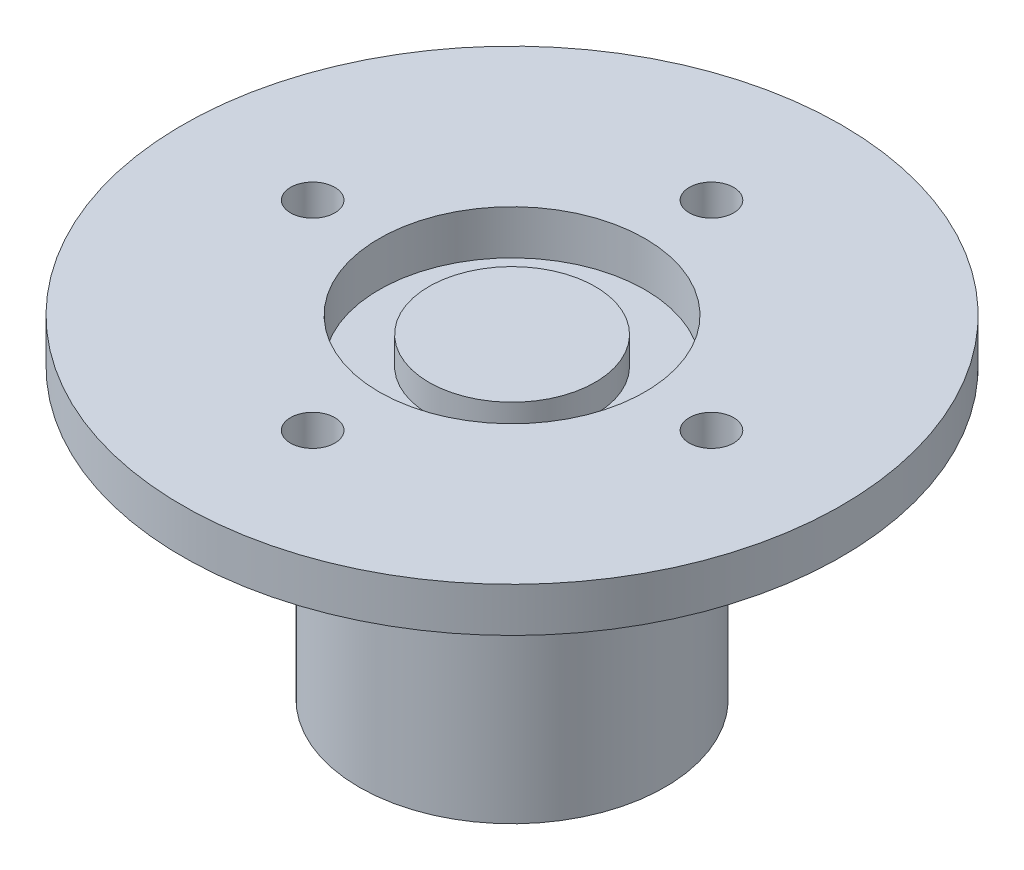
ISO-10303-21;
HEADER;
FILE_DESCRIPTION(('STEP AP214'),'2;1');
FILE_NAME('part.step','',(''),(''),'','','');
FILE_SCHEMA(('AUTOMOTIVE_DESIGN { 1 0 10303 214 1 1 1 1 }'));
ENDSEC;
DATA;
#1=APPLICATION_CONTEXT('core data for automotive mechanical design processes');
#2=APPLICATION_PROTOCOL_DEFINITION('international standard','automotive_design',2000,#1);
#3=PRODUCT_CONTEXT('',#1,'mechanical');
#4=PRODUCT('Part','Part','',(#3));
#5=PRODUCT_RELATED_PRODUCT_CATEGORY('part','',(#4));
#6=PRODUCT_DEFINITION_FORMATION('','',#4);
#7=PRODUCT_DEFINITION_CONTEXT('part definition',#1,'design');
#8=PRODUCT_DEFINITION('design','',#6,#7);
#9=PRODUCT_DEFINITION_SHAPE('','',#8);
#10=(LENGTH_UNIT() NAMED_UNIT(*) SI_UNIT(.MILLI.,.METRE.));
#11=(NAMED_UNIT(*) PLANE_ANGLE_UNIT() SI_UNIT($,.RADIAN.));
#12=(NAMED_UNIT(*) SI_UNIT($,.STERADIAN.) SOLID_ANGLE_UNIT());
#13=UNCERTAINTY_MEASURE_WITH_UNIT(LENGTH_MEASURE(1.E-05),#10,'distance_accuracy_value','');
#14=(GEOMETRIC_REPRESENTATION_CONTEXT(3) GLOBAL_UNCERTAINTY_ASSIGNED_CONTEXT((#13)) GLOBAL_UNIT_ASSIGNED_CONTEXT((#10,
#11,#12)) REPRESENTATION_CONTEXT('',''));
#15=CARTESIAN_POINT('',(0.,0.,0.));
#16=DIRECTION('',(0.,0.,1.));
#17=DIRECTION('',(1.,0.,0.));
#18=AXIS2_PLACEMENT_3D('',#15,#16,#17);
#19=CARTESIAN_POINT('',(0.,0.,0.));
#20=DIRECTION('',(0.,-1.,0.));
#21=DIRECTION('',(0.,0.,-1.));
#22=AXIS2_PLACEMENT_3D('',#19,#20,#21);
#23=PLANE('',#22);
#24=CARTESIAN_POINT('',(0.,0.,0.));
#25=DIRECTION('',(0.,1.,0.));
#26=DIRECTION('',(0.,0.,1.));
#27=AXIS2_PLACEMENT_3D('',#24,#25,#26);
#28=CIRCLE('',#27,7.5);
#29=CARTESIAN_POINT('',(0.,0.,7.5));
#30=VERTEX_POINT('',#29);
#31=EDGE_CURVE('E52',#30,#30,#28,.T.);
#32=ORIENTED_EDGE('',*,*,#31,.F.);
#33=EDGE_LOOP('',(#32));
#34=FACE_BOUND('',#33,.T.);
#35=CARTESIAN_POINT('',(0.,0.,0.));
#36=DIRECTION('',(0.,-1.,0.));
#37=DIRECTION('',(0.,0.,-1.));
#38=AXIS2_PLACEMENT_3D('',#35,#36,#37);
#39=CIRCLE('',#38,12.);
#40=CARTESIAN_POINT('',(0.,0.,-12.));
#41=VERTEX_POINT('',#40);
#42=EDGE_CURVE('E11',#41,#41,#39,.T.);
#43=ORIENTED_EDGE('',*,*,#42,.F.);
#44=EDGE_LOOP('',(#43));
#45=FACE_BOUND('',#44,.T.);
#46=ADVANCED_FACE('F39',(#34,#45),#23,.F.);
#47=CARTESIAN_POINT('',(0.,2.5,0.));
#48=DIRECTION('',(0.,-1.,0.));
#49=DIRECTION('',(0.,0.,-1.));
#50=AXIS2_PLACEMENT_3D('',#47,#48,#49);
#51=CYLINDRICAL_SURFACE('',#50,7.5);
#52=CARTESIAN_POINT('',(0.,2.5,0.));
#53=DIRECTION('',(0.,1.,0.));
#54=DIRECTION('',(0.,0.,1.));
#55=AXIS2_PLACEMENT_3D('',#52,#53,#54);
#56=CIRCLE('',#55,7.5);
#57=CARTESIAN_POINT('',(0.,2.5,7.5));
#58=VERTEX_POINT('',#57);
#59=EDGE_CURVE('E47',#58,#58,#56,.T.);
#60=ORIENTED_EDGE('',*,*,#59,.F.);
#61=EDGE_LOOP('',(#60));
#62=FACE_BOUND('',#61,.T.);
#63=ORIENTED_EDGE('',*,*,#31,.T.);
#64=EDGE_LOOP('',(#63));
#65=FACE_BOUND('',#64,.T.);
#66=ADVANCED_FACE('F41',(#62,#65),#51,.T.);
#67=CARTESIAN_POINT('',(0.,2.5,0.));
#68=DIRECTION('',(0.,1.,0.));
#69=DIRECTION('',(0.,0.,1.));
#70=AXIS2_PLACEMENT_3D('',#67,#68,#69);
#71=PLANE('',#70);
#72=ORIENTED_EDGE('',*,*,#59,.T.);
#73=EDGE_LOOP('',(#72));
#74=FACE_BOUND('',#73,.T.);
#75=ADVANCED_FACE('F107',(#74),#71,.T.);
#76=CARTESIAN_POINT('',(0.,4.,0.));
#77=DIRECTION('',(0.,-1.,0.));
#78=DIRECTION('',(0.,0.,-1.));
#79=AXIS2_PLACEMENT_3D('',#76,#77,#78);
#80=CYLINDRICAL_SURFACE('',#79,29.75);
#81=CARTESIAN_POINT('',(0.,4.,0.));
#82=DIRECTION('',(0.,-1.,0.));
#83=DIRECTION('',(0.,0.,-1.));
#84=AXIS2_PLACEMENT_3D('',#81,#82,#83);
#85=CIRCLE('',#84,29.75);
#86=CARTESIAN_POINT('',(0.,4.,-29.75));
#87=VERTEX_POINT('',#86);
#88=EDGE_CURVE('E85',#87,#87,#85,.T.);
#89=ORIENTED_EDGE('',*,*,#88,.T.);
#90=EDGE_LOOP('',(#89));
#91=FACE_BOUND('',#90,.T.);
#92=CARTESIAN_POINT('',(0.,0.,0.));
#93=DIRECTION('',(0.,-1.,0.));
#94=DIRECTION('',(0.,0.,-1.));
#95=AXIS2_PLACEMENT_3D('',#92,#93,#94);
#96=CIRCLE('',#95,29.75);
#97=CARTESIAN_POINT('',(0.,0.,-29.75));
#98=VERTEX_POINT('',#97);
#99=EDGE_CURVE('E84',#98,#98,#96,.T.);
#100=ORIENTED_EDGE('',*,*,#99,.F.);
#101=EDGE_LOOP('',(#100));
#102=FACE_BOUND('',#101,.T.);
#103=ADVANCED_FACE('F118',(#91,#102),#80,.T.);
#104=CARTESIAN_POINT('',(0.,4.,0.));
#105=DIRECTION('',(0.,-1.,0.));
#106=DIRECTION('',(0.,0.,-1.));
#107=AXIS2_PLACEMENT_3D('',#104,#105,#106);
#108=PLANE('',#107);
#109=CARTESIAN_POINT('',(0.,4.,-18.));
#110=DIRECTION('',(0.,1.,0.));
#111=DIRECTION('',(0.,0.,1.));
#112=AXIS2_PLACEMENT_3D('',#109,#110,#111);
#113=CIRCLE('',#112,2.);
#114=CARTESIAN_POINT('',(0.,4.,-16.));
#115=VERTEX_POINT('',#114);
#116=EDGE_CURVE('E60',#115,#115,#113,.T.);
#117=ORIENTED_EDGE('',*,*,#116,.F.);
#118=EDGE_LOOP('',(#117));
#119=FACE_BOUND('',#118,.T.);
#120=CARTESIAN_POINT('',(18.,4.,0.));
#121=DIRECTION('',(0.,1.,0.));
#122=DIRECTION('',(0.,0.,1.));
#123=AXIS2_PLACEMENT_3D('',#120,#121,#122);
#124=CIRCLE('',#123,2.);
#125=CARTESIAN_POINT('',(18.,4.,2.));
#126=VERTEX_POINT('',#125);
#127=EDGE_CURVE('E165',#126,#126,#124,.T.);
#128=ORIENTED_EDGE('',*,*,#127,.F.);
#129=EDGE_LOOP('',(#128));
#130=FACE_BOUND('',#129,.T.);
#131=CARTESIAN_POINT('',(0.,4.,18.));
#132=DIRECTION('',(0.,1.,0.));
#133=DIRECTION('',(0.,0.,1.));
#134=AXIS2_PLACEMENT_3D('',#131,#132,#133);
#135=CIRCLE('',#134,2.);
#136=CARTESIAN_POINT('',(0.,4.,20.));
#137=VERTEX_POINT('',#136);
#138=EDGE_CURVE('E168',#137,#137,#135,.T.);
#139=ORIENTED_EDGE('',*,*,#138,.F.);
#140=EDGE_LOOP('',(#139));
#141=FACE_BOUND('',#140,.T.);
#142=CARTESIAN_POINT('',(-18.,4.,0.));
#143=DIRECTION('',(0.,1.,0.));
#144=DIRECTION('',(0.,0.,1.));
#145=AXIS2_PLACEMENT_3D('',#142,#143,#144);
#146=CIRCLE('',#145,2.);
#147=CARTESIAN_POINT('',(-18.,4.,2.00000000000001));
#148=VERTEX_POINT('',#147);
#149=EDGE_CURVE('E79',#148,#148,#146,.T.);
#150=ORIENTED_EDGE('',*,*,#149,.F.);
#151=EDGE_LOOP('',(#150));
#152=FACE_BOUND('',#151,.T.);
#153=CARTESIAN_POINT('',(0.,4.,0.));
#154=DIRECTION('',(0.,-1.,0.));
#155=DIRECTION('',(0.,0.,-1.));
#156=AXIS2_PLACEMENT_3D('',#153,#154,#155);
#157=CIRCLE('',#156,12.);
#158=CARTESIAN_POINT('',(0.,4.,-12.));
#159=VERTEX_POINT('',#158);
#160=EDGE_CURVE('E76',#159,#159,#157,.T.);
#161=ORIENTED_EDGE('',*,*,#160,.T.);
#162=EDGE_LOOP('',(#161));
#163=FACE_BOUND('',#162,.T.);
#164=ORIENTED_EDGE('',*,*,#88,.F.);
#165=EDGE_LOOP('',(#164));
#166=FACE_BOUND('',#165,.T.);
#167=ADVANCED_FACE('F123',(#119,#130,#141,#152,#163,#166),#108,.F.);
#168=CARTESIAN_POINT('',(0.,0.,0.));
#169=DIRECTION('',(0.,-1.,0.));
#170=DIRECTION('',(0.,0.,-1.));
#171=AXIS2_PLACEMENT_3D('',#168,#169,#170);
#172=PLANE('',#171);
#173=CARTESIAN_POINT('',(0.,0.,-18.));
#174=DIRECTION('',(0.,-1.,0.));
#175=DIRECTION('',(0.,0.,-1.));
#176=AXIS2_PLACEMENT_3D('',#173,#174,#175);
#177=CIRCLE('',#176,2.);
#178=CARTESIAN_POINT('',(0.,0.,-20.));
#179=VERTEX_POINT('',#178);
#180=EDGE_CURVE('E43',#179,#179,#177,.T.);
#181=ORIENTED_EDGE('',*,*,#180,.F.);
#182=EDGE_LOOP('',(#181));
#183=FACE_BOUND('',#182,.T.);
#184=CARTESIAN_POINT('',(18.,0.,0.));
#185=DIRECTION('',(0.,-1.,0.));
#186=DIRECTION('',(0.,0.,-1.));
#187=AXIS2_PLACEMENT_3D('',#184,#185,#186);
#188=CIRCLE('',#187,2.);
#189=CARTESIAN_POINT('',(18.,0.,-2.));
#190=VERTEX_POINT('',#189);
#191=EDGE_CURVE('E62',#190,#190,#188,.T.);
#192=ORIENTED_EDGE('',*,*,#191,.F.);
#193=EDGE_LOOP('',(#192));
#194=FACE_BOUND('',#193,.T.);
#195=CARTESIAN_POINT('',(0.,0.,18.));
#196=DIRECTION('',(0.,-1.,0.));
#197=DIRECTION('',(0.,0.,-1.));
#198=AXIS2_PLACEMENT_3D('',#195,#196,#197);
#199=CIRCLE('',#198,2.);
#200=CARTESIAN_POINT('',(0.,0.,16.));
#201=VERTEX_POINT('',#200);
#202=EDGE_CURVE('E59',#201,#201,#199,.T.);
#203=ORIENTED_EDGE('',*,*,#202,.F.);
#204=EDGE_LOOP('',(#203));
#205=FACE_BOUND('',#204,.T.);
#206=CARTESIAN_POINT('',(-18.,0.,0.));
#207=DIRECTION('',(0.,-1.,0.));
#208=DIRECTION('',(0.,0.,-1.));
#209=AXIS2_PLACEMENT_3D('',#206,#207,#208);
#210=CIRCLE('',#209,2.);
#211=CARTESIAN_POINT('',(-18.,0.,-2.));
#212=VERTEX_POINT('',#211);
#213=EDGE_CURVE('E56',#212,#212,#210,.T.);
#214=ORIENTED_EDGE('',*,*,#213,.F.);
#215=EDGE_LOOP('',(#214));
#216=FACE_BOUND('',#215,.T.);
#217=CARTESIAN_POINT('',(0.,0.,0.));
#218=DIRECTION('',(0.,-1.,0.));
#219=DIRECTION('',(0.,0.,-1.));
#220=AXIS2_PLACEMENT_3D('',#217,#218,#219);
#221=CIRCLE('',#220,13.8);
#222=CARTESIAN_POINT('',(0.,0.,13.8));
#223=VERTEX_POINT('',#222);
#224=EDGE_CURVE('E88',#223,#223,#221,.T.);
#225=ORIENTED_EDGE('',*,*,#224,.F.);
#226=EDGE_LOOP('',(#225));
#227=FACE_BOUND('',#226,.T.);
#228=ORIENTED_EDGE('',*,*,#99,.T.);
#229=EDGE_LOOP('',(#228));
#230=FACE_BOUND('',#229,.T.);
#231=ADVANCED_FACE('F129',(#183,#194,#205,#216,#227,#230),#172,.T.);
#232=CARTESIAN_POINT('',(0.,4.,0.));
#233=DIRECTION('',(0.,-1.,0.));
#234=DIRECTION('',(0.,0.,-1.));
#235=AXIS2_PLACEMENT_3D('',#232,#233,#234);
#236=CYLINDRICAL_SURFACE('',#235,12.);
#237=ORIENTED_EDGE('',*,*,#160,.F.);
#238=EDGE_LOOP('',(#237));
#239=FACE_BOUND('',#238,.T.);
#240=ORIENTED_EDGE('',*,*,#42,.T.);
#241=EDGE_LOOP('',(#240));
#242=FACE_BOUND('',#241,.T.);
#243=ADVANCED_FACE('F135',(#239,#242),#236,.F.);
#244=CARTESIAN_POINT('',(0.,-26.,0.));
#245=DIRECTION('',(0.,-1.,0.));
#246=DIRECTION('',(0.,0.,-1.));
#247=AXIS2_PLACEMENT_3D('',#244,#245,#246);
#248=PLANE('',#247);
#249=CARTESIAN_POINT('',(0.,-26.,0.));
#250=DIRECTION('',(0.,-1.,0.));
#251=DIRECTION('',(0.,0.,-1.));
#252=AXIS2_PLACEMENT_3D('',#249,#250,#251);
#253=CIRCLE('',#252,5.);
#254=CARTESIAN_POINT('',(0.,-26.,-5.));
#255=VERTEX_POINT('',#254);
#256=EDGE_CURVE('E67',#255,#255,#253,.T.);
#257=ORIENTED_EDGE('',*,*,#256,.F.);
#258=EDGE_LOOP('',(#257));
#259=FACE_BOUND('',#258,.T.);
#260=CARTESIAN_POINT('',(0.,-26.,0.));
#261=DIRECTION('',(0.,-1.,0.));
#262=DIRECTION('',(0.,0.,-1.));
#263=AXIS2_PLACEMENT_3D('',#260,#261,#262);
#264=CIRCLE('',#263,13.8);
#265=CARTESIAN_POINT('',(0.,-26.,13.8));
#266=VERTEX_POINT('',#265);
#267=EDGE_CURVE('E93',#266,#266,#264,.T.);
#268=ORIENTED_EDGE('',*,*,#267,.T.);
#269=EDGE_LOOP('',(#268));
#270=FACE_BOUND('',#269,.T.);
#271=ADVANCED_FACE('F111',(#259,#270),#248,.T.);
#272=CARTESIAN_POINT('',(0.,-26.,0.));
#273=DIRECTION('',(0.,1.,0.));
#274=DIRECTION('',(0.,0.,1.));
#275=AXIS2_PLACEMENT_3D('',#272,#273,#274);
#276=CYLINDRICAL_SURFACE('',#275,13.8);
#277=CARTESIAN_POINT('',(0.,-26.,13.8));
#278=CARTESIAN_POINT('',(0.,-25.7291666666667,13.8));
#279=CARTESIAN_POINT('',(0.,-25.4583333333333,13.8));
#280=CARTESIAN_POINT('',(0.,-24.9166666666667,13.8));
#281=CARTESIAN_POINT('',(0.,-24.6458333333333,13.8));
#282=CARTESIAN_POINT('',(0.,-24.1041666666667,13.8));
#283=CARTESIAN_POINT('',(0.,-23.8333333333333,13.8));
#284=CARTESIAN_POINT('',(0.,-23.2916666666667,13.8));
#285=CARTESIAN_POINT('',(0.,-23.0208333333333,13.8));
#286=CARTESIAN_POINT('',(0.,-22.4791666666667,13.8));
#287=CARTESIAN_POINT('',(0.,-22.2083333333333,13.8));
#288=CARTESIAN_POINT('',(0.,-21.6666666666667,13.8));
#289=CARTESIAN_POINT('',(0.,-21.3958333333333,13.8));
#290=CARTESIAN_POINT('',(0.,-20.8541666666667,13.8));
#291=CARTESIAN_POINT('',(0.,-20.5833333333333,13.8));
#292=CARTESIAN_POINT('',(0.,-20.0416666666667,13.8));
#293=CARTESIAN_POINT('',(0.,-19.7708333333333,13.8));
#294=CARTESIAN_POINT('',(0.,-19.2291666666667,13.8));
#295=CARTESIAN_POINT('',(0.,-18.9583333333333,13.8));
#296=CARTESIAN_POINT('',(0.,-18.4166666666667,13.8));
#297=CARTESIAN_POINT('',(0.,-18.1458333333333,13.8));
#298=CARTESIAN_POINT('',(0.,-17.6041666666667,13.8));
#299=CARTESIAN_POINT('',(0.,-17.3333333333333,13.8));
#300=CARTESIAN_POINT('',(0.,-16.7916666666667,13.8));
#301=CARTESIAN_POINT('',(0.,-16.5208333333333,13.8));
#302=CARTESIAN_POINT('',(0.,-15.9791666666667,13.8));
#303=CARTESIAN_POINT('',(0.,-15.7083333333333,13.8));
#304=CARTESIAN_POINT('',(0.,-15.1666666666667,13.8));
#305=CARTESIAN_POINT('',(0.,-14.8958333333333,13.8));
#306=CARTESIAN_POINT('',(0.,-14.3541666666667,13.8));
#307=CARTESIAN_POINT('',(0.,-14.0833333333333,13.8));
#308=CARTESIAN_POINT('',(0.,-13.5416666666667,13.8));
#309=CARTESIAN_POINT('',(0.,-13.2708333333333,13.8));
#310=CARTESIAN_POINT('',(0.,-12.7291666666667,13.8));
#311=CARTESIAN_POINT('',(0.,-12.4583333333333,13.8));
#312=CARTESIAN_POINT('',(0.,-11.9166666666667,13.8));
#313=CARTESIAN_POINT('',(0.,-11.6458333333333,13.8));
#314=CARTESIAN_POINT('',(0.,-11.1041666666667,13.8));
#315=CARTESIAN_POINT('',(0.,-10.8333333333333,13.8));
#316=CARTESIAN_POINT('',(0.,-10.2916666666667,13.8));
#317=CARTESIAN_POINT('',(0.,-10.0208333333333,13.8));
#318=CARTESIAN_POINT('',(0.,-9.47916666666667,13.8));
#319=CARTESIAN_POINT('',(0.,-9.20833333333333,13.8));
#320=CARTESIAN_POINT('',(0.,-8.66666666666667,13.8));
#321=CARTESIAN_POINT('',(0.,-8.39583333333333,13.8));
#322=CARTESIAN_POINT('',(0.,-7.85416666666667,13.8));
#323=CARTESIAN_POINT('',(0.,-7.58333333333333,13.8));
#324=CARTESIAN_POINT('',(0.,-7.04166666666667,13.8));
#325=CARTESIAN_POINT('',(0.,-6.77083333333333,13.8));
#326=CARTESIAN_POINT('',(0.,-6.22916666666667,13.8));
#327=CARTESIAN_POINT('',(0.,-5.95833333333333,13.8));
#328=CARTESIAN_POINT('',(0.,-5.41666666666667,13.8));
#329=CARTESIAN_POINT('',(0.,-5.14583333333333,13.8));
#330=CARTESIAN_POINT('',(0.,-4.60416666666667,13.8));
#331=CARTESIAN_POINT('',(0.,-4.33333333333333,13.8));
#332=CARTESIAN_POINT('',(0.,-3.79166666666667,13.8));
#333=CARTESIAN_POINT('',(0.,-3.52083333333333,13.8));
#334=CARTESIAN_POINT('',(0.,-2.97916666666667,13.8));
#335=CARTESIAN_POINT('',(0.,-2.70833333333333,13.8));
#336=CARTESIAN_POINT('',(0.,-2.16666666666667,13.8));
#337=CARTESIAN_POINT('',(0.,-1.89583333333333,13.8));
#338=CARTESIAN_POINT('',(0.,-1.35416666666667,13.8));
#339=CARTESIAN_POINT('',(0.,-1.08333333333333,13.8));
#340=CARTESIAN_POINT('',(0.,-0.541666666666667,13.8));
#341=CARTESIAN_POINT('',(0.,-0.270833333333334,13.8));
#342=CARTESIAN_POINT('',(0.,0.,13.8));
#343=B_SPLINE_CURVE_WITH_KNOTS('',3,(#277,#278,#279,#280,#281,#282,#283,#284,#285,#286,#287,
#288,#289,#290,#291,#292,#293,#294,#295,#296,#297,#298,#299,#300,#301,#302,#303,#304,#305,#306,
#307,#308,#309,#310,#311,#312,#313,#314,#315,#316,#317,#318,#319,#320,#321,#322,#323,#324,#325,
#326,#327,#328,#329,#330,#331,#332,#333,#334,#335,#336,#337,#338,#339,#340,#341,#342),
.UNSPECIFIED.,.F.,.F.,(4,2,2,2,2,2,2,2,2,2,2,2,2,2,2,2,2,2,2,2,2,2,2,2,2,2,2,2,2,2,2,2,4),(0.,
0.812499999999997,1.625,2.4375,3.25,4.0625,4.875,5.6875,6.5,7.3125,8.125,8.93749999999999,
9.74999999999999,10.5625,11.375,12.1875,13.,13.8125,14.625,15.4375,16.25,17.0625,17.875,18.6875,
19.5,20.3125,21.125,21.9375,22.75,23.5625,24.375,25.1875,26.),.UNSPECIFIED.);
#344=EDGE_CURVE('BSEAM113',#266,#223,#343,.T.);
#345=ORIENTED_EDGE('',*,*,#267,.F.);
#346=ORIENTED_EDGE('',*,*,#224,.T.);
#347=ORIENTED_EDGE('',*,*,#344,.T.);
#348=ORIENTED_EDGE('',*,*,#344,.F.);
#349=EDGE_LOOP('',(#345,#347,#346,#348));
#350=FACE_BOUND('',#349,.T.);
#351=ADVANCED_FACE('F113',(#350),#276,.T.);
#352=CARTESIAN_POINT('',(0.,-0.5,0.));
#353=DIRECTION('',(0.,1.,0.));
#354=DIRECTION('',(0.,0.,1.));
#355=AXIS2_PLACEMENT_3D('',#352,#353,#354);
#356=PLANE('',#355);
#357=CARTESIAN_POINT('',(0.,-0.5,0.));
#358=DIRECTION('',(0.,1.,0.));
#359=DIRECTION('',(0.,0.,1.));
#360=AXIS2_PLACEMENT_3D('',#357,#358,#359);
#361=CIRCLE('',#360,5.);
#362=CARTESIAN_POINT('',(0.,-0.5,5.));
#363=VERTEX_POINT('',#362);
#364=EDGE_CURVE('E71',#363,#363,#361,.F.);
#365=ORIENTED_EDGE('',*,*,#364,.T.);
#366=EDGE_LOOP('',(#365));
#367=FACE_BOUND('',#366,.T.);
#368=ADVANCED_FACE('F115',(#367),#356,.F.);
#369=CARTESIAN_POINT('',(0.,16.642135623731,0.));
#370=DIRECTION('',(0.,-1.,0.));
#371=DIRECTION('',(0.,0.,-1.));
#372=AXIS2_PLACEMENT_3D('',#369,#370,#371);
#373=CYLINDRICAL_SURFACE('',#372,5.);
#374=ORIENTED_EDGE('',*,*,#256,.T.);
#375=EDGE_LOOP('',(#374));
#376=FACE_BOUND('',#375,.T.);
#377=ORIENTED_EDGE('',*,*,#364,.F.);
#378=EDGE_LOOP('',(#377));
#379=FACE_BOUND('',#378,.T.);
#380=ADVANCED_FACE('F143',(#376,#379),#373,.F.);
#381=CARTESIAN_POINT('',(-18.,-26.,0.));
#382=DIRECTION('',(0.,1.,0.));
#383=DIRECTION('',(0.,0.,1.));
#384=AXIS2_PLACEMENT_3D('',#381,#382,#383);
#385=CYLINDRICAL_SURFACE('',#384,2.);
#386=ORIENTED_EDGE('',*,*,#213,.T.);
#387=EDGE_LOOP('',(#386));
#388=FACE_BOUND('',#387,.T.);
#389=ORIENTED_EDGE('',*,*,#149,.T.);
#390=EDGE_LOOP('',(#389));
#391=FACE_BOUND('',#390,.T.);
#392=ADVANCED_FACE('F147',(#388,#391),#385,.F.);
#393=CARTESIAN_POINT('',(0.,-26.,18.));
#394=DIRECTION('',(0.,1.,0.));
#395=DIRECTION('',(0.,0.,1.));
#396=AXIS2_PLACEMENT_3D('',#393,#394,#395);
#397=CYLINDRICAL_SURFACE('',#396,2.);
#398=ORIENTED_EDGE('',*,*,#202,.T.);
#399=EDGE_LOOP('',(#398));
#400=FACE_BOUND('',#399,.T.);
#401=ORIENTED_EDGE('',*,*,#138,.T.);
#402=EDGE_LOOP('',(#401));
#403=FACE_BOUND('',#402,.T.);
#404=ADVANCED_FACE('F150',(#400,#403),#397,.F.);
#405=CARTESIAN_POINT('',(18.,-26.,0.));
#406=DIRECTION('',(0.,1.,0.));
#407=DIRECTION('',(0.,0.,1.));
#408=AXIS2_PLACEMENT_3D('',#405,#406,#407);
#409=CYLINDRICAL_SURFACE('',#408,2.);
#410=ORIENTED_EDGE('',*,*,#191,.T.);
#411=EDGE_LOOP('',(#410));
#412=FACE_BOUND('',#411,.T.);
#413=ORIENTED_EDGE('',*,*,#127,.T.);
#414=EDGE_LOOP('',(#413));
#415=FACE_BOUND('',#414,.T.);
#416=ADVANCED_FACE('F154',(#412,#415),#409,.F.);
#417=CARTESIAN_POINT('',(0.,-26.,-18.));
#418=DIRECTION('',(0.,1.,0.));
#419=DIRECTION('',(0.,0.,1.));
#420=AXIS2_PLACEMENT_3D('',#417,#418,#419);
#421=CYLINDRICAL_SURFACE('',#420,2.);
#422=ORIENTED_EDGE('',*,*,#180,.T.);
#423=EDGE_LOOP('',(#422));
#424=FACE_BOUND('',#423,.T.);
#425=ORIENTED_EDGE('',*,*,#116,.T.);
#426=EDGE_LOOP('',(#425));
#427=FACE_BOUND('',#426,.T.);
#428=ADVANCED_FACE('F158',(#424,#427),#421,.F.);
#429=CLOSED_SHELL('',(#46,#66,#75,#103,#167,#231,#243,#271,#351,#368,#380,#392,#404,#416,#428));
#430=MANIFOLD_SOLID_BREP('B2',#429);
#431=ADVANCED_BREP_SHAPE_REPRESENTATION('',(#18,#430),#14);
#432=SHAPE_DEFINITION_REPRESENTATION(#9,#431);
ENDSEC;
END-ISO-10303-21;
